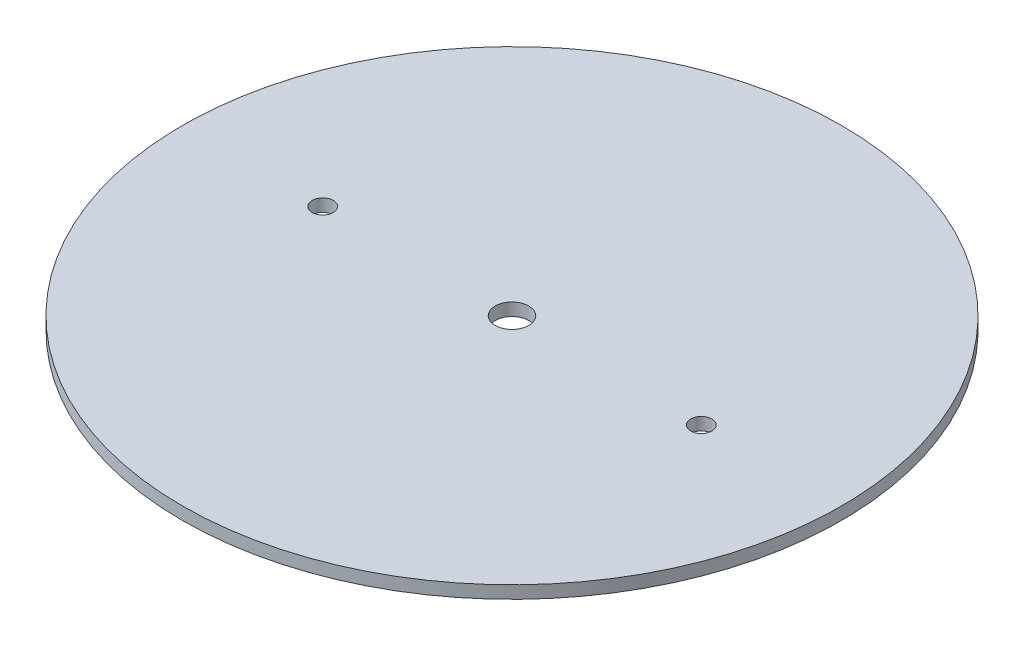
ISO-10303-21;
HEADER;
FILE_DESCRIPTION(('STEP AP214'),'2;1');
FILE_NAME('part.step','',(''),(''),'','','');
FILE_SCHEMA(('AUTOMOTIVE_DESIGN { 1 0 10303 214 1 1 1 1 }'));
ENDSEC;
DATA;
#1=APPLICATION_CONTEXT('core data for automotive mechanical design processes');
#2=APPLICATION_PROTOCOL_DEFINITION('international standard','automotive_design',2000,#1);
#3=PRODUCT_CONTEXT('',#1,'mechanical');
#4=PRODUCT('Part','Part','',(#3));
#5=PRODUCT_RELATED_PRODUCT_CATEGORY('part','',(#4));
#6=PRODUCT_DEFINITION_FORMATION('','',#4);
#7=PRODUCT_DEFINITION_CONTEXT('part definition',#1,'design');
#8=PRODUCT_DEFINITION('design','',#6,#7);
#9=PRODUCT_DEFINITION_SHAPE('','',#8);
#10=(LENGTH_UNIT() NAMED_UNIT(*) SI_UNIT(.MILLI.,.METRE.));
#11=(NAMED_UNIT(*) PLANE_ANGLE_UNIT() SI_UNIT($,.RADIAN.));
#12=(NAMED_UNIT(*) SI_UNIT($,.STERADIAN.) SOLID_ANGLE_UNIT());
#13=UNCERTAINTY_MEASURE_WITH_UNIT(LENGTH_MEASURE(1.E-05),#10,'distance_accuracy_value','');
#14=(GEOMETRIC_REPRESENTATION_CONTEXT(3) GLOBAL_UNCERTAINTY_ASSIGNED_CONTEXT((#13)) GLOBAL_UNIT_ASSIGNED_CONTEXT((#10,
#11,#12)) REPRESENTATION_CONTEXT('',''));
#15=CARTESIAN_POINT('',(0.,0.,0.));
#16=DIRECTION('',(0.,0.,1.));
#17=DIRECTION('',(1.,0.,0.));
#18=AXIS2_PLACEMENT_3D('',#15,#16,#17);
#19=CARTESIAN_POINT('',(45.,3.,0.));
#20=DIRECTION('',(0.,-1.,0.));
#21=DIRECTION('',(0.,0.,-1.));
#22=AXIS2_PLACEMENT_3D('',#19,#20,#21);
#23=CYLINDRICAL_SURFACE('',#22,2.5);
#24=CARTESIAN_POINT('',(45.,3.,0.));
#25=DIRECTION('',(0.,1.,0.));
#26=DIRECTION('',(0.,0.,1.));
#27=AXIS2_PLACEMENT_3D('',#24,#25,#26);
#28=CIRCLE('',#27,2.5);
#29=CARTESIAN_POINT('',(45.,3.,2.49999999999999));
#30=VERTEX_POINT('',#29);
#31=EDGE_CURVE('E48',#30,#30,#28,.T.);
#32=ORIENTED_EDGE('',*,*,#31,.T.);
#33=EDGE_LOOP('',(#32));
#34=FACE_BOUND('',#33,.T.);
#35=CARTESIAN_POINT('',(45.,0.,0.));
#36=DIRECTION('',(0.,1.,0.));
#37=DIRECTION('',(0.,0.,1.));
#38=AXIS2_PLACEMENT_3D('',#35,#36,#37);
#39=CIRCLE('',#38,2.5);
#40=CARTESIAN_POINT('',(45.,0.,2.49999999999999));
#41=VERTEX_POINT('',#40);
#42=EDGE_CURVE('E65',#41,#41,#39,.T.);
#43=ORIENTED_EDGE('',*,*,#42,.F.);
#44=EDGE_LOOP('',(#43));
#45=FACE_BOUND('',#44,.T.);
#46=ADVANCED_FACE('F39',(#34,#45),#23,.F.);
#47=CARTESIAN_POINT('',(-45.,3.,0.));
#48=DIRECTION('',(0.,-1.,0.));
#49=DIRECTION('',(0.,0.,-1.));
#50=AXIS2_PLACEMENT_3D('',#47,#48,#49);
#51=CYLINDRICAL_SURFACE('',#50,2.5);
#52=CARTESIAN_POINT('',(-45.,3.,0.));
#53=DIRECTION('',(0.,1.,0.));
#54=DIRECTION('',(0.,0.,1.));
#55=AXIS2_PLACEMENT_3D('',#52,#53,#54);
#56=CIRCLE('',#55,2.5);
#57=CARTESIAN_POINT('',(-45.,3.,2.50000000000001));
#58=VERTEX_POINT('',#57);
#59=EDGE_CURVE('E54',#58,#58,#56,.T.);
#60=ORIENTED_EDGE('',*,*,#59,.T.);
#61=EDGE_LOOP('',(#60));
#62=FACE_BOUND('',#61,.T.);
#63=CARTESIAN_POINT('',(-45.,0.,0.));
#64=DIRECTION('',(0.,1.,0.));
#65=DIRECTION('',(0.,0.,1.));
#66=AXIS2_PLACEMENT_3D('',#63,#64,#65);
#67=CIRCLE('',#66,2.5);
#68=CARTESIAN_POINT('',(-45.,0.,2.50000000000001));
#69=VERTEX_POINT('',#68);
#70=EDGE_CURVE('E62',#69,#69,#67,.T.);
#71=ORIENTED_EDGE('',*,*,#70,.F.);
#72=EDGE_LOOP('',(#71));
#73=FACE_BOUND('',#72,.T.);
#74=ADVANCED_FACE('F84',(#62,#73),#51,.F.);
#75=CARTESIAN_POINT('',(0.,3.,0.));
#76=DIRECTION('',(0.,-1.,0.));
#77=DIRECTION('',(0.,0.,-1.));
#78=AXIS2_PLACEMENT_3D('',#75,#76,#77);
#79=CYLINDRICAL_SURFACE('',#78,4.);
#80=CARTESIAN_POINT('',(0.,3.,0.));
#81=DIRECTION('',(0.,1.,0.));
#82=DIRECTION('',(0.,0.,1.));
#83=AXIS2_PLACEMENT_3D('',#80,#81,#82);
#84=CIRCLE('',#83,4.);
#85=CARTESIAN_POINT('',(0.,3.,4.));
#86=VERTEX_POINT('',#85);
#87=EDGE_CURVE('E72',#86,#86,#84,.T.);
#88=ORIENTED_EDGE('',*,*,#87,.T.);
#89=EDGE_LOOP('',(#88));
#90=FACE_BOUND('',#89,.T.);
#91=CARTESIAN_POINT('',(0.,0.,0.));
#92=DIRECTION('',(0.,1.,0.));
#93=DIRECTION('',(0.,0.,1.));
#94=AXIS2_PLACEMENT_3D('',#91,#92,#93);
#95=CIRCLE('',#94,4.);
#96=CARTESIAN_POINT('',(0.,0.,4.));
#97=VERTEX_POINT('',#96);
#98=EDGE_CURVE('E58',#97,#97,#95,.T.);
#99=ORIENTED_EDGE('',*,*,#98,.F.);
#100=EDGE_LOOP('',(#99));
#101=FACE_BOUND('',#100,.T.);
#102=ADVANCED_FACE('F41',(#90,#101),#79,.F.);
#103=CARTESIAN_POINT('',(0.,3.,0.));
#104=DIRECTION('',(0.,-1.,0.));
#105=DIRECTION('',(0.,0.,-1.));
#106=AXIS2_PLACEMENT_3D('',#103,#104,#105);
#107=CYLINDRICAL_SURFACE('',#106,78.35);
#108=CARTESIAN_POINT('',(0.,3.,0.));
#109=DIRECTION('',(0.,1.,0.));
#110=DIRECTION('',(0.,0.,1.));
#111=AXIS2_PLACEMENT_3D('',#108,#109,#110);
#112=CIRCLE('',#111,78.35);
#113=CARTESIAN_POINT('',(0.,3.,78.35));
#114=VERTEX_POINT('',#113);
#115=EDGE_CURVE('E10',#114,#114,#112,.T.);
#116=ORIENTED_EDGE('',*,*,#115,.F.);
#117=EDGE_LOOP('',(#116));
#118=FACE_BOUND('',#117,.T.);
#119=CARTESIAN_POINT('',(0.,0.,0.));
#120=DIRECTION('',(0.,1.,0.));
#121=DIRECTION('',(0.,0.,1.));
#122=AXIS2_PLACEMENT_3D('',#119,#120,#121);
#123=CIRCLE('',#122,78.35);
#124=CARTESIAN_POINT('',(0.,0.,78.35));
#125=VERTEX_POINT('',#124);
#126=EDGE_CURVE('E43',#125,#125,#123,.T.);
#127=ORIENTED_EDGE('',*,*,#126,.T.);
#128=EDGE_LOOP('',(#127));
#129=FACE_BOUND('',#128,.T.);
#130=ADVANCED_FACE('F91',(#118,#129),#107,.T.);
#131=CARTESIAN_POINT('',(0.,3.,0.));
#132=DIRECTION('',(0.,1.,0.));
#133=DIRECTION('',(0.,0.,1.));
#134=AXIS2_PLACEMENT_3D('',#131,#132,#133);
#135=PLANE('',#134);
#136=ORIENTED_EDGE('',*,*,#87,.F.);
#137=EDGE_LOOP('',(#136));
#138=FACE_BOUND('',#137,.T.);
#139=ORIENTED_EDGE('',*,*,#59,.F.);
#140=EDGE_LOOP('',(#139));
#141=FACE_BOUND('',#140,.T.);
#142=ORIENTED_EDGE('',*,*,#31,.F.);
#143=EDGE_LOOP('',(#142));
#144=FACE_BOUND('',#143,.T.);
#145=ORIENTED_EDGE('',*,*,#115,.T.);
#146=EDGE_LOOP('',(#145));
#147=FACE_BOUND('',#146,.T.);
#148=ADVANCED_FACE('F87',(#138,#141,#144,#147),#135,.T.);
#149=CARTESIAN_POINT('',(0.,0.,0.));
#150=DIRECTION('',(0.,1.,0.));
#151=DIRECTION('',(0.,0.,1.));
#152=AXIS2_PLACEMENT_3D('',#149,#150,#151);
#153=PLANE('',#152);
#154=ORIENTED_EDGE('',*,*,#98,.T.);
#155=EDGE_LOOP('',(#154));
#156=FACE_BOUND('',#155,.T.);
#157=ORIENTED_EDGE('',*,*,#70,.T.);
#158=EDGE_LOOP('',(#157));
#159=FACE_BOUND('',#158,.T.);
#160=ORIENTED_EDGE('',*,*,#42,.T.);
#161=EDGE_LOOP('',(#160));
#162=FACE_BOUND('',#161,.T.);
#163=ORIENTED_EDGE('',*,*,#126,.F.);
#164=EDGE_LOOP('',(#163));
#165=FACE_BOUND('',#164,.T.);
#166=ADVANCED_FACE('F90',(#156,#159,#162,#165),#153,.F.);
#167=CLOSED_SHELL('',(#46,#74,#102,#130,#148,#166));
#168=MANIFOLD_SOLID_BREP('B2',#167);
#169=ADVANCED_BREP_SHAPE_REPRESENTATION('',(#18,#168),#14);
#170=SHAPE_DEFINITION_REPRESENTATION(#9,#169);
ENDSEC;
END-ISO-10303-21;
